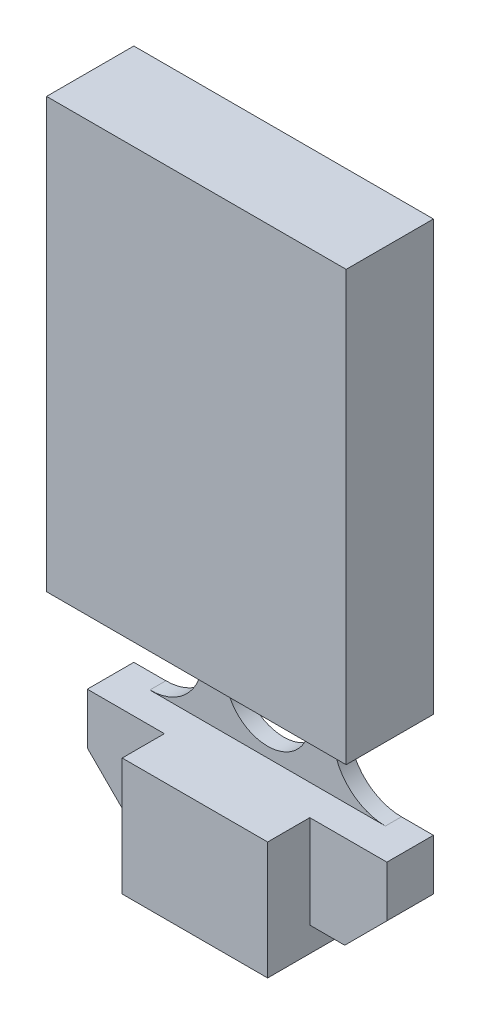
ISO-10303-21;
HEADER;
FILE_DESCRIPTION(('STEP AP214'),'2;1');
FILE_NAME('part.step','',(''),(''),'','','');
FILE_SCHEMA(('AUTOMOTIVE_DESIGN { 1 0 10303 214 1 1 1 1 }'));
ENDSEC;
DATA;
#1=APPLICATION_CONTEXT('core data for automotive mechanical design processes');
#2=APPLICATION_PROTOCOL_DEFINITION('international standard','automotive_design',2000,#1);
#3=PRODUCT_CONTEXT('',#1,'mechanical');
#4=PRODUCT('Part','Part','',(#3));
#5=PRODUCT_RELATED_PRODUCT_CATEGORY('part','',(#4));
#6=PRODUCT_DEFINITION_FORMATION('','',#4);
#7=PRODUCT_DEFINITION_CONTEXT('part definition',#1,'design');
#8=PRODUCT_DEFINITION('design','',#6,#7);
#9=PRODUCT_DEFINITION_SHAPE('','',#8);
#10=(LENGTH_UNIT() NAMED_UNIT(*) SI_UNIT(.MILLI.,.METRE.));
#11=(NAMED_UNIT(*) PLANE_ANGLE_UNIT() SI_UNIT($,.RADIAN.));
#12=(NAMED_UNIT(*) SI_UNIT($,.STERADIAN.) SOLID_ANGLE_UNIT());
#13=UNCERTAINTY_MEASURE_WITH_UNIT(LENGTH_MEASURE(1.E-05),#10,'distance_accuracy_value','');
#14=(GEOMETRIC_REPRESENTATION_CONTEXT(3) GLOBAL_UNCERTAINTY_ASSIGNED_CONTEXT((#13)) GLOBAL_UNIT_ASSIGNED_CONTEXT((#10,
#11,#12)) REPRESENTATION_CONTEXT('',''));
#15=CARTESIAN_POINT('',(0.,0.,0.));
#16=DIRECTION('',(0.,0.,1.));
#17=DIRECTION('',(1.,0.,0.));
#18=AXIS2_PLACEMENT_3D('',#15,#16,#17);
#19=CARTESIAN_POINT('',(0.,0.,1.1));
#20=DIRECTION('',(0.,0.,-1.));
#21=DIRECTION('',(-1.,0.,0.));
#22=AXIS2_PLACEMENT_3D('',#19,#20,#21);
#23=PLANE('',#22);
#24=CARTESIAN_POINT('',(10.3,10.,1.1));
#25=DIRECTION('',(0.,0.,1.));
#26=DIRECTION('',(1.,0.,0.));
#27=AXIS2_PLACEMENT_3D('',#24,#25,#26);
#28=CIRCLE('',#27,2.9);
#29=CARTESIAN_POINT('',(13.2,10.,1.1));
#30=VERTEX_POINT('',#29);
#31=EDGE_CURVE('E219',#30,#30,#28,.T.);
#32=ORIENTED_EDGE('',*,*,#31,.F.);
#33=EDGE_LOOP('',(#32));
#34=FACE_BOUND('',#33,.T.);
#35=DIRECTION('',(-1.,0.,0.));
#36=VECTOR('',#35,1.);
#37=CARTESIAN_POINT('',(5.3,6.4,1.1));
#38=LINE('',#37,#36);
#39=CARTESIAN_POINT('',(18.4,6.4,1.1));
#40=VERTEX_POINT('',#39);
#41=CARTESIAN_POINT('',(2.2,6.4,1.1));
#42=VERTEX_POINT('',#41);
#43=EDGE_CURVE('E278',#40,#42,#38,.T.);
#44=ORIENTED_EDGE('',*,*,#43,.F.);
#45=CARTESIAN_POINT('',(18.4,10.,1.1));
#46=DIRECTION('',(0.,0.,1.));
#47=DIRECTION('',(1.,0.,0.));
#48=AXIS2_PLACEMENT_3D('',#45,#46,#47);
#49=CIRCLE('',#48,3.6);
#50=CARTESIAN_POINT('',(18.4,13.6,1.1));
#51=VERTEX_POINT('',#50);
#52=EDGE_CURVE('E303',#51,#40,#49,.T.);
#53=ORIENTED_EDGE('',*,*,#52,.F.);
#54=DIRECTION('',(1.,0.,0.));
#55=VECTOR('',#54,1.);
#56=CARTESIAN_POINT('',(0.,13.6,1.1));
#57=LINE('',#56,#55);
#58=CARTESIAN_POINT('',(2.2,13.6,1.1));
#59=VERTEX_POINT('',#58);
#60=EDGE_CURVE('E218',#59,#51,#57,.T.);
#61=ORIENTED_EDGE('',*,*,#60,.F.);
#62=CARTESIAN_POINT('',(2.2,10.,1.1));
#63=DIRECTION('',(0.,0.,1.));
#64=DIRECTION('',(-1.,0.,0.));
#65=AXIS2_PLACEMENT_3D('',#62,#63,#64);
#66=CIRCLE('',#65,3.6);
#67=EDGE_CURVE('E315',#42,#59,#66,.T.);
#68=ORIENTED_EDGE('',*,*,#67,.F.);
#69=EDGE_LOOP('',(#44,#53,#61,#68));
#70=FACE_BOUND('',#69,.T.);
#71=ADVANCED_FACE('F33',(#34,#70),#23,.F.);
#72=CARTESIAN_POINT('',(5.3,-1.7,6.1));
#73=DIRECTION('',(1.,0.,0.));
#74=DIRECTION('',(0.,0.,-1.));
#75=AXIS2_PLACEMENT_3D('',#72,#73,#74);
#76=PLANE('',#75);
#77=DIRECTION('',(0.,0.,1.));
#78=VECTOR('',#77,1.);
#79=CARTESIAN_POINT('',(5.3,0.,6.1));
#80=LINE('',#79,#78);
#81=CARTESIAN_POINT('',(5.3,0.,1.1));
#82=VERTEX_POINT('',#81);
#83=CARTESIAN_POINT('',(5.3,0.,3.2));
#84=VERTEX_POINT('',#83);
#85=EDGE_CURVE('E270',#82,#84,#80,.T.);
#86=ORIENTED_EDGE('',*,*,#85,.F.);
#87=DIRECTION('',(0.,-1.,0.));
#88=VECTOR('',#87,1.);
#89=CARTESIAN_POINT('',(5.3,-1.7,1.1));
#90=LINE('',#89,#88);
#91=CARTESIAN_POINT('',(5.3,-1.7,1.1));
#92=VERTEX_POINT('',#91);
#93=EDGE_CURVE('E273',#82,#92,#90,.T.);
#94=ORIENTED_EDGE('',*,*,#93,.T.);
#95=DIRECTION('',(0.,0.,-1.));
#96=VECTOR('',#95,1.);
#97=CARTESIAN_POINT('',(5.3,-1.7,6.1));
#98=LINE('',#97,#96);
#99=CARTESIAN_POINT('',(5.3,-1.7,6.1));
#100=VERTEX_POINT('',#99);
#101=EDGE_CURVE('E300',#100,#92,#98,.T.);
#102=ORIENTED_EDGE('',*,*,#101,.F.);
#103=DIRECTION('',(0.,-1.,0.));
#104=VECTOR('',#103,1.);
#105=CARTESIAN_POINT('',(5.3,-1.7,6.1));
#106=LINE('',#105,#104);
#107=CARTESIAN_POINT('',(5.3,6.4,6.1));
#108=VERTEX_POINT('',#107);
#109=EDGE_CURVE('E274',#108,#100,#106,.T.);
#110=ORIENTED_EDGE('',*,*,#109,.F.);
#111=DIRECTION('',(0.,0.,-1.));
#112=VECTOR('',#111,1.);
#113=CARTESIAN_POINT('',(5.3,6.4,6.1));
#114=LINE('',#113,#112);
#115=CARTESIAN_POINT('',(5.3,6.4,3.2));
#116=VERTEX_POINT('',#115);
#117=EDGE_CURVE('E284',#108,#116,#114,.T.);
#118=ORIENTED_EDGE('',*,*,#117,.T.);
#119=DIRECTION('',(0.,-1.,0.));
#120=VECTOR('',#119,1.);
#121=CARTESIAN_POINT('',(5.3,-1.7,3.2));
#122=LINE('',#121,#120);
#123=EDGE_CURVE('E267',#116,#84,#122,.T.);
#124=ORIENTED_EDGE('',*,*,#123,.T.);
#125=EDGE_LOOP('',(#86,#94,#102,#110,#118,#124));
#126=FACE_BOUND('',#125,.T.);
#127=ADVANCED_FACE('F379',(#126),#76,.F.);
#128=CARTESIAN_POINT('',(15.3,-1.7,6.1));
#129=DIRECTION('',(-1.,0.,0.));
#130=DIRECTION('',(0.,0.,1.));
#131=AXIS2_PLACEMENT_3D('',#128,#129,#130);
#132=PLANE('',#131);
#133=DIRECTION('',(0.,0.,-1.));
#134=VECTOR('',#133,1.);
#135=CARTESIAN_POINT('',(15.3,0.,6.1));
#136=LINE('',#135,#134);
#137=CARTESIAN_POINT('',(15.3,0.,3.2));
#138=VERTEX_POINT('',#137);
#139=CARTESIAN_POINT('',(15.3,0.,1.1));
#140=VERTEX_POINT('',#139);
#141=EDGE_CURVE('E11',#138,#140,#136,.T.);
#142=ORIENTED_EDGE('',*,*,#141,.F.);
#143=DIRECTION('',(0.,1.,0.));
#144=VECTOR('',#143,1.);
#145=CARTESIAN_POINT('',(15.3,-1.7,3.2));
#146=LINE('',#145,#144);
#147=CARTESIAN_POINT('',(15.3,6.4,3.2));
#148=VERTEX_POINT('',#147);
#149=EDGE_CURVE('E264',#138,#148,#146,.T.);
#150=ORIENTED_EDGE('',*,*,#149,.T.);
#151=DIRECTION('',(0.,0.,-1.));
#152=VECTOR('',#151,1.);
#153=CARTESIAN_POINT('',(15.3,6.4,6.1));
#154=LINE('',#153,#152);
#155=CARTESIAN_POINT('',(15.3,6.4,6.1));
#156=VERTEX_POINT('',#155);
#157=EDGE_CURVE('E294',#156,#148,#154,.T.);
#158=ORIENTED_EDGE('',*,*,#157,.F.);
#159=DIRECTION('',(0.,1.,0.));
#160=VECTOR('',#159,1.);
#161=CARTESIAN_POINT('',(15.3,-1.7,6.1));
#162=LINE('',#161,#160);
#163=CARTESIAN_POINT('',(15.3,-1.7,6.1));
#164=VERTEX_POINT('',#163);
#165=EDGE_CURVE('E280',#164,#156,#162,.T.);
#166=ORIENTED_EDGE('',*,*,#165,.F.);
#167=DIRECTION('',(0.,0.,-1.));
#168=VECTOR('',#167,1.);
#169=CARTESIAN_POINT('',(15.3,-1.7,6.1));
#170=LINE('',#169,#168);
#171=CARTESIAN_POINT('',(15.3,-1.7,1.1));
#172=VERTEX_POINT('',#171);
#173=EDGE_CURVE('E297',#164,#172,#170,.T.);
#174=ORIENTED_EDGE('',*,*,#173,.T.);
#175=DIRECTION('',(0.,1.,0.));
#176=VECTOR('',#175,1.);
#177=CARTESIAN_POINT('',(15.3,-1.7,1.1));
#178=LINE('',#177,#176);
#179=EDGE_CURVE('E288',#172,#140,#178,.T.);
#180=ORIENTED_EDGE('',*,*,#179,.T.);
#181=EDGE_LOOP('',(#142,#150,#158,#166,#174,#180));
#182=FACE_BOUND('',#181,.T.);
#183=ADVANCED_FACE('F385',(#182),#132,.F.);
#184=CARTESIAN_POINT('',(20.6,0.,1.1));
#185=DIRECTION('',(-1.,0.,0.));
#186=DIRECTION('',(0.,-1.,0.));
#187=AXIS2_PLACEMENT_3D('',#184,#185,#186);
#188=PLANE('',#187);
#189=DIRECTION('',(0.,1.,0.));
#190=VECTOR('',#189,1.);
#191=CARTESIAN_POINT('',(20.6,6.4,3.2));
#192=LINE('',#191,#190);
#193=CARTESIAN_POINT('',(20.6,2.9,3.2));
#194=VERTEX_POINT('',#193);
#195=CARTESIAN_POINT('',(20.6,6.4,3.2));
#196=VERTEX_POINT('',#195);
#197=EDGE_CURVE('E183',#194,#196,#192,.T.);
#198=ORIENTED_EDGE('',*,*,#197,.F.);
#199=DIRECTION('',(0.,0.,1.));
#200=VECTOR('',#199,1.);
#201=CARTESIAN_POINT('',(20.6,2.9,0.));
#202=LINE('',#201,#200);
#203=CARTESIAN_POINT('',(20.6,2.9,0.));
#204=VERTEX_POINT('',#203);
#205=EDGE_CURVE('E48',#204,#194,#202,.T.);
#206=ORIENTED_EDGE('',*,*,#205,.F.);
#207=DIRECTION('',(0.,1.,0.));
#208=VECTOR('',#207,1.);
#209=CARTESIAN_POINT('',(20.6,0.,0.));
#210=LINE('',#209,#208);
#211=CARTESIAN_POINT('',(20.6,6.4,0.));
#212=VERTEX_POINT('',#211);
#213=EDGE_CURVE('E181',#204,#212,#210,.T.);
#214=ORIENTED_EDGE('',*,*,#213,.T.);
#215=DIRECTION('',(0.,0.,1.));
#216=VECTOR('',#215,1.);
#217=CARTESIAN_POINT('',(20.6,6.4,-3.8));
#218=LINE('',#217,#216);
#219=EDGE_CURVE('E307',#212,#196,#218,.T.);
#220=ORIENTED_EDGE('',*,*,#219,.T.);
#221=EDGE_LOOP('',(#198,#206,#214,#220));
#222=FACE_BOUND('',#221,.T.);
#223=ADVANCED_FACE('F179',(#222),#188,.F.);
#224=CARTESIAN_POINT('',(0.,0.,1.1));
#225=DIRECTION('',(1.,0.,0.));
#226=DIRECTION('',(0.,0.,-1.));
#227=AXIS2_PLACEMENT_3D('',#224,#225,#226);
#228=PLANE('',#227);
#229=DIRECTION('',(0.,-1.,0.));
#230=VECTOR('',#229,1.);
#231=CARTESIAN_POINT('',(0.,0.,0.));
#232=LINE('',#231,#230);
#233=CARTESIAN_POINT('',(0.,43.1,0.));
#234=VERTEX_POINT('',#233);
#235=CARTESIAN_POINT('',(0.,13.6,0.));
#236=VERTEX_POINT('',#235);
#237=EDGE_CURVE('E230',#234,#236,#232,.T.);
#238=ORIENTED_EDGE('',*,*,#237,.T.);
#239=DIRECTION('',(0.,0.,-1.));
#240=VECTOR('',#239,1.);
#241=CARTESIAN_POINT('',(0.,13.6,6.));
#242=LINE('',#241,#240);
#243=CARTESIAN_POINT('',(0.,13.6,6.));
#244=VERTEX_POINT('',#243);
#245=EDGE_CURVE('E207',#244,#236,#242,.T.);
#246=ORIENTED_EDGE('',*,*,#245,.F.);
#247=DIRECTION('',(0.,-1.,0.));
#248=VECTOR('',#247,1.);
#249=CARTESIAN_POINT('',(0.,43.1,6.));
#250=LINE('',#249,#248);
#251=CARTESIAN_POINT('',(0.,43.1,6.));
#252=VERTEX_POINT('',#251);
#253=EDGE_CURVE('E223',#252,#244,#250,.T.);
#254=ORIENTED_EDGE('',*,*,#253,.F.);
#255=DIRECTION('',(0.,0.,-1.));
#256=VECTOR('',#255,1.);
#257=CARTESIAN_POINT('',(0.,43.1,1.1));
#258=LINE('',#257,#256);
#259=EDGE_CURVE('E198',#252,#234,#258,.T.);
#260=ORIENTED_EDGE('',*,*,#259,.T.);
#261=EDGE_LOOP('',(#238,#246,#254,#260));
#262=FACE_BOUND('',#261,.T.);
#263=ADVANCED_FACE('F340',(#262),#228,.F.);
#264=CARTESIAN_POINT('',(0.,6.4,0.));
#265=VERTEX_POINT('',#264);
#266=CARTESIAN_POINT('',(0.,2.9,0.));
#267=VERTEX_POINT('',#266);
#268=EDGE_CURVE('E212',#265,#267,#232,.T.);
#269=ORIENTED_EDGE('',*,*,#268,.T.);
#270=DIRECTION('',(0.,0.,1.));
#271=VECTOR('',#270,1.);
#272=CARTESIAN_POINT('',(0.,2.9,0.));
#273=LINE('',#272,#271);
#274=CARTESIAN_POINT('',(0.,2.9,3.2));
#275=VERTEX_POINT('',#274);
#276=EDGE_CURVE('E241',#267,#275,#273,.T.);
#277=ORIENTED_EDGE('',*,*,#276,.T.);
#278=DIRECTION('',(0.,-1.,0.));
#279=VECTOR('',#278,1.);
#280=CARTESIAN_POINT('',(0.,6.4,3.2));
#281=LINE('',#280,#279);
#282=CARTESIAN_POINT('',(0.,6.4,3.2));
#283=VERTEX_POINT('',#282);
#284=EDGE_CURVE('E254',#283,#275,#281,.T.);
#285=ORIENTED_EDGE('',*,*,#284,.F.);
#286=DIRECTION('',(0.,0.,1.));
#287=VECTOR('',#286,1.);
#288=CARTESIAN_POINT('',(0.,6.4,-3.8));
#289=LINE('',#288,#287);
#290=EDGE_CURVE('E243',#265,#283,#289,.T.);
#291=ORIENTED_EDGE('',*,*,#290,.F.);
#292=EDGE_LOOP('',(#269,#277,#285,#291));
#293=FACE_BOUND('',#292,.T.);
#294=ADVANCED_FACE('F35',(#293),#228,.F.);
#295=CARTESIAN_POINT('',(0.,0.,1.1));
#296=DIRECTION('',(0.,1.,0.));
#297=DIRECTION('',(0.,0.,1.));
#298=AXIS2_PLACEMENT_3D('',#295,#296,#297);
#299=PLANE('',#298);
#300=DIRECTION('',(1.,0.,0.));
#301=VECTOR('',#300,1.);
#302=CARTESIAN_POINT('',(0.,0.,0.));
#303=LINE('',#302,#301);
#304=CARTESIAN_POINT('',(2.89999999999997,0.,0.));
#305=VERTEX_POINT('',#304);
#306=CARTESIAN_POINT('',(17.7,0.,0.));
#307=VERTEX_POINT('',#306);
#308=EDGE_CURVE('E194',#305,#307,#303,.T.);
#309=ORIENTED_EDGE('',*,*,#308,.T.);
#310=DIRECTION('',(0.,0.,1.));
#311=VECTOR('',#310,1.);
#312=CARTESIAN_POINT('',(17.7,0.,0.));
#313=LINE('',#312,#311);
#314=CARTESIAN_POINT('',(17.7,0.,3.2));
#315=VERTEX_POINT('',#314);
#316=EDGE_CURVE('E170',#307,#315,#313,.T.);
#317=ORIENTED_EDGE('',*,*,#316,.T.);
#318=DIRECTION('',(1.,0.,0.));
#319=VECTOR('',#318,1.);
#320=CARTESIAN_POINT('',(0.,0.,3.2));
#321=LINE('',#320,#319);
#322=EDGE_CURVE('E257',#138,#315,#321,.T.);
#323=ORIENTED_EDGE('',*,*,#322,.F.);
#324=ORIENTED_EDGE('',*,*,#141,.T.);
#325=DIRECTION('',(1.,0.,0.));
#326=VECTOR('',#325,1.);
#327=CARTESIAN_POINT('',(0.,0.,1.1));
#328=LINE('',#327,#326);
#329=EDGE_CURVE('E192',#82,#140,#328,.T.);
#330=ORIENTED_EDGE('',*,*,#329,.F.);
#331=ORIENTED_EDGE('',*,*,#85,.T.);
#332=CARTESIAN_POINT('',(2.89999999999997,0.,3.2));
#333=VERTEX_POINT('',#332);
#334=EDGE_CURVE('E258',#333,#84,#321,.T.);
#335=ORIENTED_EDGE('',*,*,#334,.F.);
#336=DIRECTION('',(0.,0.,1.));
#337=VECTOR('',#336,1.);
#338=CARTESIAN_POINT('',(2.89999999999997,0.,0.));
#339=LINE('',#338,#337);
#340=EDGE_CURVE('E56',#305,#333,#339,.T.);
#341=ORIENTED_EDGE('',*,*,#340,.F.);
#342=EDGE_LOOP('',(#309,#317,#323,#324,#330,#331,#335,#341));
#343=FACE_BOUND('',#342,.T.);
#344=ADVANCED_FACE('F399',(#343),#299,.F.);
#345=DIRECTION('',(0.,0.,-1.));
#346=VECTOR('',#345,1.);
#347=CARTESIAN_POINT('',(20.6,13.6,6.));
#348=LINE('',#347,#346);
#349=CARTESIAN_POINT('',(20.6,13.6,6.));
#350=VERTEX_POINT('',#349);
#351=CARTESIAN_POINT('',(20.6,13.6,0.));
#352=VERTEX_POINT('',#351);
#353=EDGE_CURVE('E205',#350,#352,#348,.T.);
#354=ORIENTED_EDGE('',*,*,#353,.T.);
#355=CARTESIAN_POINT('',(20.6,43.1,0.));
#356=VERTEX_POINT('',#355);
#357=EDGE_CURVE('E190',#352,#356,#210,.T.);
#358=ORIENTED_EDGE('',*,*,#357,.T.);
#359=DIRECTION('',(0.,0.,-1.));
#360=VECTOR('',#359,1.);
#361=CARTESIAN_POINT('',(20.6,43.1,1.1));
#362=LINE('',#361,#360);
#363=CARTESIAN_POINT('',(20.6,43.1,6.));
#364=VERTEX_POINT('',#363);
#365=EDGE_CURVE('E201',#364,#356,#362,.T.);
#366=ORIENTED_EDGE('',*,*,#365,.F.);
#367=DIRECTION('',(0.,1.,0.));
#368=VECTOR('',#367,1.);
#369=CARTESIAN_POINT('',(20.6,43.1,6.));
#370=LINE('',#369,#368);
#371=EDGE_CURVE('E331',#350,#364,#370,.T.);
#372=ORIENTED_EDGE('',*,*,#371,.F.);
#373=EDGE_LOOP('',(#354,#358,#366,#372));
#374=FACE_BOUND('',#373,.T.);
#375=ADVANCED_FACE('F397',(#374),#188,.F.);
#376=CARTESIAN_POINT('',(0.,43.1,1.1));
#377=DIRECTION('',(0.,-1.,0.));
#378=DIRECTION('',(0.,0.,-1.));
#379=AXIS2_PLACEMENT_3D('',#376,#377,#378);
#380=PLANE('',#379);
#381=DIRECTION('',(-1.,0.,0.));
#382=VECTOR('',#381,1.);
#383=CARTESIAN_POINT('',(0.,43.1,0.));
#384=LINE('',#383,#382);
#385=EDGE_CURVE('E189',#356,#234,#384,.T.);
#386=ORIENTED_EDGE('',*,*,#385,.T.);
#387=ORIENTED_EDGE('',*,*,#259,.F.);
#388=DIRECTION('',(-1.,0.,0.));
#389=VECTOR('',#388,1.);
#390=CARTESIAN_POINT('',(0.,43.1,6.));
#391=LINE('',#390,#389);
#392=EDGE_CURVE('E208',#364,#252,#391,.T.);
#393=ORIENTED_EDGE('',*,*,#392,.F.);
#394=ORIENTED_EDGE('',*,*,#365,.T.);
#395=EDGE_LOOP('',(#386,#387,#393,#394));
#396=FACE_BOUND('',#395,.T.);
#397=ADVANCED_FACE('F394',(#396),#380,.F.);
#398=CARTESIAN_POINT('',(0.,0.,0.));
#399=DIRECTION('',(0.,0.,-1.));
#400=DIRECTION('',(-1.,0.,0.));
#401=AXIS2_PLACEMENT_3D('',#398,#399,#400);
#402=PLANE('',#401);
#403=DIRECTION('',(-0.707106781186551,-0.707106781186544,0.));
#404=VECTOR('',#403,1.);
#405=CARTESIAN_POINT('',(20.6,2.9,0.));
#406=LINE('',#405,#404);
#407=EDGE_CURVE('E167',#204,#307,#406,.T.);
#408=ORIENTED_EDGE('',*,*,#407,.T.);
#409=ORIENTED_EDGE('',*,*,#308,.F.);
#410=DIRECTION('',(-0.707106781186544,0.707106781186551,0.));
#411=VECTOR('',#410,1.);
#412=CARTESIAN_POINT('',(0.,2.9,0.));
#413=LINE('',#412,#411);
#414=EDGE_CURVE('E247',#305,#267,#413,.T.);
#415=ORIENTED_EDGE('',*,*,#414,.T.);
#416=ORIENTED_EDGE('',*,*,#268,.F.);
#417=DIRECTION('',(-1.,0.,0.));
#418=VECTOR('',#417,1.);
#419=CARTESIAN_POINT('',(0.,6.4,0.));
#420=LINE('',#419,#418);
#421=CARTESIAN_POINT('',(2.2,6.4,0.));
#422=VERTEX_POINT('',#421);
#423=EDGE_CURVE('E204',#422,#265,#420,.T.);
#424=ORIENTED_EDGE('',*,*,#423,.F.);
#425=CARTESIAN_POINT('',(2.2,10.,0.));
#426=DIRECTION('',(0.,0.,-1.));
#427=DIRECTION('',(-1.,0.,0.));
#428=AXIS2_PLACEMENT_3D('',#425,#426,#427);
#429=CIRCLE('',#428,3.6);
#430=CARTESIAN_POINT('',(2.2,13.6,0.));
#431=VERTEX_POINT('',#430);
#432=EDGE_CURVE('E320',#431,#422,#429,.T.);
#433=ORIENTED_EDGE('',*,*,#432,.F.);
#434=DIRECTION('',(1.,0.,0.));
#435=VECTOR('',#434,1.);
#436=CARTESIAN_POINT('',(0.,13.6,0.));
#437=LINE('',#436,#435);
#438=EDGE_CURVE('E344',#236,#431,#437,.T.);
#439=ORIENTED_EDGE('',*,*,#438,.F.);
#440=ORIENTED_EDGE('',*,*,#237,.F.);
#441=ORIENTED_EDGE('',*,*,#385,.F.);
#442=ORIENTED_EDGE('',*,*,#357,.F.);
#443=DIRECTION('',(1.,0.,0.));
#444=VECTOR('',#443,1.);
#445=CARTESIAN_POINT('',(0.,13.6,0.));
#446=LINE('',#445,#444);
#447=CARTESIAN_POINT('',(18.4,13.6,0.));
#448=VERTEX_POINT('',#447);
#449=EDGE_CURVE('E348',#448,#352,#446,.T.);
#450=ORIENTED_EDGE('',*,*,#449,.F.);
#451=CARTESIAN_POINT('',(18.4,10.,0.));
#452=DIRECTION('',(0.,0.,-1.));
#453=DIRECTION('',(-1.,0.,0.));
#454=AXIS2_PLACEMENT_3D('',#451,#452,#453);
#455=CIRCLE('',#454,3.6);
#456=CARTESIAN_POINT('',(18.4,6.4,0.));
#457=VERTEX_POINT('',#456);
#458=EDGE_CURVE('E309',#457,#448,#455,.T.);
#459=ORIENTED_EDGE('',*,*,#458,.F.);
#460=DIRECTION('',(-1.,0.,0.));
#461=VECTOR('',#460,1.);
#462=CARTESIAN_POINT('',(0.,6.4,0.));
#463=LINE('',#462,#461);
#464=EDGE_CURVE('E41',#212,#457,#463,.T.);
#465=ORIENTED_EDGE('',*,*,#464,.F.);
#466=ORIENTED_EDGE('',*,*,#213,.F.);
#467=EDGE_LOOP('',(#408,#409,#415,#416,#424,#433,#439,#440,#441,#442,#450,#459,#465,#466));
#468=FACE_BOUND('',#467,.T.);
#469=CARTESIAN_POINT('',(10.3,10.,0.));
#470=DIRECTION('',(0.,0.,-1.));
#471=DIRECTION('',(-1.,0.,0.));
#472=AXIS2_PLACEMENT_3D('',#469,#470,#471);
#473=CIRCLE('',#472,2.9);
#474=CARTESIAN_POINT('',(7.4,10.,0.));
#475=VERTEX_POINT('',#474);
#476=EDGE_CURVE('E215',#475,#475,#473,.T.);
#477=ORIENTED_EDGE('',*,*,#476,.F.);
#478=EDGE_LOOP('',(#477));
#479=FACE_BOUND('',#478,.T.);
#480=ADVANCED_FACE('F186',(#468,#479),#402,.T.);
#481=CARTESIAN_POINT('',(0.,13.6,6.));
#482=DIRECTION('',(0.,1.,0.));
#483=DIRECTION('',(0.,0.,1.));
#484=AXIS2_PLACEMENT_3D('',#481,#482,#483);
#485=PLANE('',#484);
#486=ORIENTED_EDGE('',*,*,#245,.T.);
#487=ORIENTED_EDGE('',*,*,#438,.T.);
#488=DIRECTION('',(0.,0.,1.));
#489=VECTOR('',#488,1.);
#490=CARTESIAN_POINT('',(2.2,13.6,-3.8));
#491=LINE('',#490,#489);
#492=EDGE_CURVE('E317',#431,#59,#491,.T.);
#493=ORIENTED_EDGE('',*,*,#492,.T.);
#494=ORIENTED_EDGE('',*,*,#60,.T.);
#495=DIRECTION('',(0.,0.,1.));
#496=VECTOR('',#495,1.);
#497=CARTESIAN_POINT('',(18.4,13.6,-3.8));
#498=LINE('',#497,#496);
#499=EDGE_CURVE('E306',#448,#51,#498,.T.);
#500=ORIENTED_EDGE('',*,*,#499,.F.);
#501=ORIENTED_EDGE('',*,*,#449,.T.);
#502=ORIENTED_EDGE('',*,*,#353,.F.);
#503=DIRECTION('',(1.,0.,0.));
#504=VECTOR('',#503,1.);
#505=CARTESIAN_POINT('',(0.,13.6,6.));
#506=LINE('',#505,#504);
#507=EDGE_CURVE('E330',#244,#350,#506,.T.);
#508=ORIENTED_EDGE('',*,*,#507,.F.);
#509=EDGE_LOOP('',(#486,#487,#493,#494,#500,#501,#502,#508));
#510=FACE_BOUND('',#509,.T.);
#511=ADVANCED_FACE('F343',(#510),#485,.F.);
#512=CARTESIAN_POINT('',(0.,0.,6.));
#513=DIRECTION('',(0.,0.,1.));
#514=DIRECTION('',(1.,0.,0.));
#515=AXIS2_PLACEMENT_3D('',#512,#513,#514);
#516=PLANE('',#515);
#517=ORIENTED_EDGE('',*,*,#253,.T.);
#518=ORIENTED_EDGE('',*,*,#507,.T.);
#519=ORIENTED_EDGE('',*,*,#371,.T.);
#520=ORIENTED_EDGE('',*,*,#392,.T.);
#521=EDGE_LOOP('',(#517,#518,#519,#520));
#522=FACE_BOUND('',#521,.T.);
#523=ADVANCED_FACE('F338',(#522),#516,.T.);
#524=CARTESIAN_POINT('',(10.3,10.,-3.8));
#525=DIRECTION('',(0.,0.,1.));
#526=DIRECTION('',(1.,0.,0.));
#527=AXIS2_PLACEMENT_3D('',#524,#525,#526);
#528=CYLINDRICAL_SURFACE('',#527,2.9);
#529=ORIENTED_EDGE('',*,*,#476,.T.);
#530=EDGE_LOOP('',(#529));
#531=FACE_BOUND('',#530,.T.);
#532=ORIENTED_EDGE('',*,*,#31,.T.);
#533=EDGE_LOOP('',(#532));
#534=FACE_BOUND('',#533,.T.);
#535=ADVANCED_FACE('F368',(#531,#534),#528,.F.);
#536=CARTESIAN_POINT('',(2.2,10.,-3.8));
#537=DIRECTION('',(0.,0.,1.));
#538=DIRECTION('',(1.,0.,0.));
#539=AXIS2_PLACEMENT_3D('',#536,#537,#538);
#540=CYLINDRICAL_SURFACE('',#539,3.6);
#541=ORIENTED_EDGE('',*,*,#432,.T.);
#542=DIRECTION('',(0.,0.,1.));
#543=VECTOR('',#542,1.);
#544=CARTESIAN_POINT('',(2.2,6.4,-3.8));
#545=LINE('',#544,#543);
#546=EDGE_CURVE('E321',#422,#42,#545,.T.);
#547=ORIENTED_EDGE('',*,*,#546,.T.);
#548=ORIENTED_EDGE('',*,*,#67,.T.);
#549=ORIENTED_EDGE('',*,*,#492,.F.);
#550=EDGE_LOOP('',(#541,#547,#548,#549));
#551=FACE_BOUND('',#550,.T.);
#552=ADVANCED_FACE('F366',(#551),#540,.F.);
#553=CARTESIAN_POINT('',(2.2,6.4,-3.8));
#554=DIRECTION('',(0.,-1.,0.));
#555=DIRECTION('',(1.,0.,0.));
#556=AXIS2_PLACEMENT_3D('',#553,#554,#555);
#557=PLANE('',#556);
#558=ORIENTED_EDGE('',*,*,#423,.T.);
#559=ORIENTED_EDGE('',*,*,#290,.T.);
#560=DIRECTION('',(-1.,0.,0.));
#561=VECTOR('',#560,1.);
#562=CARTESIAN_POINT('',(0.,6.4,3.2));
#563=LINE('',#562,#561);
#564=EDGE_CURVE('E261',#116,#283,#563,.T.);
#565=ORIENTED_EDGE('',*,*,#564,.F.);
#566=ORIENTED_EDGE('',*,*,#117,.F.);
#567=DIRECTION('',(-1.,0.,0.));
#568=VECTOR('',#567,1.);
#569=CARTESIAN_POINT('',(5.3,6.4,6.1));
#570=LINE('',#569,#568);
#571=EDGE_CURVE('E282',#156,#108,#570,.T.);
#572=ORIENTED_EDGE('',*,*,#571,.F.);
#573=ORIENTED_EDGE('',*,*,#157,.T.);
#574=EDGE_CURVE('E262',#196,#148,#563,.T.);
#575=ORIENTED_EDGE('',*,*,#574,.F.);
#576=ORIENTED_EDGE('',*,*,#219,.F.);
#577=ORIENTED_EDGE('',*,*,#464,.T.);
#578=DIRECTION('',(0.,0.,1.));
#579=VECTOR('',#578,1.);
#580=CARTESIAN_POINT('',(18.4,6.4,-3.8));
#581=LINE('',#580,#579);
#582=EDGE_CURVE('E310',#457,#40,#581,.T.);
#583=ORIENTED_EDGE('',*,*,#582,.T.);
#584=ORIENTED_EDGE('',*,*,#43,.T.);
#585=ORIENTED_EDGE('',*,*,#546,.F.);
#586=EDGE_LOOP('',(#558,#559,#565,#566,#572,#573,#575,#576,#577,#583,#584,#585));
#587=FACE_BOUND('',#586,.T.);
#588=ADVANCED_FACE('F353',(#587),#557,.F.);
#589=CARTESIAN_POINT('',(18.4,10.,-3.8));
#590=DIRECTION('',(0.,0.,1.));
#591=DIRECTION('',(1.,0.,0.));
#592=AXIS2_PLACEMENT_3D('',#589,#590,#591);
#593=CYLINDRICAL_SURFACE('',#592,3.6);
#594=ORIENTED_EDGE('',*,*,#458,.T.);
#595=ORIENTED_EDGE('',*,*,#499,.T.);
#596=ORIENTED_EDGE('',*,*,#52,.T.);
#597=ORIENTED_EDGE('',*,*,#582,.F.);
#598=EDGE_LOOP('',(#594,#595,#596,#597));
#599=FACE_BOUND('',#598,.T.);
#600=ADVANCED_FACE('F356',(#599),#593,.F.);
#601=CARTESIAN_POINT('',(0.,0.,1.1));
#602=DIRECTION('',(0.,0.,-1.));
#603=DIRECTION('',(-1.,0.,0.));
#604=AXIS2_PLACEMENT_3D('',#601,#602,#603);
#605=PLANE('',#604);
#606=ORIENTED_EDGE('',*,*,#329,.T.);
#607=ORIENTED_EDGE('',*,*,#179,.F.);
#608=DIRECTION('',(1.,0.,0.));
#609=VECTOR('',#608,1.);
#610=CARTESIAN_POINT('',(5.3,-1.7,1.1));
#611=LINE('',#610,#609);
#612=EDGE_CURVE('E286',#92,#172,#611,.T.);
#613=ORIENTED_EDGE('',*,*,#612,.F.);
#614=ORIENTED_EDGE('',*,*,#93,.F.);
#615=EDGE_LOOP('',(#606,#607,#613,#614));
#616=FACE_BOUND('',#615,.T.);
#617=ADVANCED_FACE('F430',(#616),#605,.T.);
#618=CARTESIAN_POINT('',(5.3,-1.7,6.1));
#619=DIRECTION('',(0.,1.,0.));
#620=DIRECTION('',(0.,0.,1.));
#621=AXIS2_PLACEMENT_3D('',#618,#619,#620);
#622=PLANE('',#621);
#623=ORIENTED_EDGE('',*,*,#612,.T.);
#624=ORIENTED_EDGE('',*,*,#173,.F.);
#625=DIRECTION('',(1.,0.,0.));
#626=VECTOR('',#625,1.);
#627=CARTESIAN_POINT('',(5.3,-1.7,6.1));
#628=LINE('',#627,#626);
#629=EDGE_CURVE('E277',#100,#164,#628,.T.);
#630=ORIENTED_EDGE('',*,*,#629,.F.);
#631=ORIENTED_EDGE('',*,*,#101,.T.);
#632=EDGE_LOOP('',(#623,#624,#630,#631));
#633=FACE_BOUND('',#632,.T.);
#634=ADVANCED_FACE('F428',(#633),#622,.F.);
#635=CARTESIAN_POINT('',(0.,0.,6.1));
#636=DIRECTION('',(0.,0.,-1.));
#637=DIRECTION('',(-1.,0.,0.));
#638=AXIS2_PLACEMENT_3D('',#635,#636,#637);
#639=PLANE('',#638);
#640=ORIENTED_EDGE('',*,*,#109,.T.);
#641=ORIENTED_EDGE('',*,*,#629,.T.);
#642=ORIENTED_EDGE('',*,*,#165,.T.);
#643=ORIENTED_EDGE('',*,*,#571,.T.);
#644=EDGE_LOOP('',(#640,#641,#642,#643));
#645=FACE_BOUND('',#644,.T.);
#646=ADVANCED_FACE('F425',(#645),#639,.F.);
#647=CARTESIAN_POINT('',(0.,0.,3.2));
#648=DIRECTION('',(0.,0.,1.));
#649=DIRECTION('',(1.,0.,0.));
#650=AXIS2_PLACEMENT_3D('',#647,#648,#649);
#651=PLANE('',#650);
#652=DIRECTION('',(-0.707106781186551,-0.707106781186544,0.));
#653=VECTOR('',#652,1.);
#654=CARTESIAN_POINT('',(20.6,2.9,3.2));
#655=LINE('',#654,#653);
#656=EDGE_CURVE('E175',#194,#315,#655,.T.);
#657=ORIENTED_EDGE('',*,*,#656,.F.);
#658=ORIENTED_EDGE('',*,*,#197,.T.);
#659=ORIENTED_EDGE('',*,*,#574,.T.);
#660=ORIENTED_EDGE('',*,*,#149,.F.);
#661=ORIENTED_EDGE('',*,*,#322,.T.);
#662=EDGE_LOOP('',(#657,#658,#659,#660,#661));
#663=FACE_BOUND('',#662,.T.);
#664=ADVANCED_FACE('F422',(#663),#651,.T.);
#665=DIRECTION('',(-0.707106781186544,0.707106781186551,0.));
#666=VECTOR('',#665,1.);
#667=CARTESIAN_POINT('',(0.,2.9,3.2));
#668=LINE('',#667,#666);
#669=EDGE_CURVE('E248',#333,#275,#668,.T.);
#670=ORIENTED_EDGE('',*,*,#669,.F.);
#671=ORIENTED_EDGE('',*,*,#334,.T.);
#672=ORIENTED_EDGE('',*,*,#123,.F.);
#673=ORIENTED_EDGE('',*,*,#564,.T.);
#674=ORIENTED_EDGE('',*,*,#284,.T.);
#675=EDGE_LOOP('',(#670,#671,#672,#673,#674));
#676=FACE_BOUND('',#675,.T.);
#677=ADVANCED_FACE('F411',(#676),#651,.T.);
#678=CARTESIAN_POINT('',(0.,2.9,0.));
#679=DIRECTION('',(0.707106781186551,0.707106781186544,0.));
#680=DIRECTION('',(-0.707106781186544,0.707106781186551,0.));
#681=AXIS2_PLACEMENT_3D('',#678,#679,#680);
#682=PLANE('',#681);
#683=ORIENTED_EDGE('',*,*,#669,.T.);
#684=ORIENTED_EDGE('',*,*,#276,.F.);
#685=ORIENTED_EDGE('',*,*,#414,.F.);
#686=ORIENTED_EDGE('',*,*,#340,.T.);
#687=EDGE_LOOP('',(#683,#684,#685,#686));
#688=FACE_BOUND('',#687,.T.);
#689=ADVANCED_FACE('F414',(#688),#682,.F.);
#690=CARTESIAN_POINT('',(20.6,2.9,0.));
#691=DIRECTION('',(-0.707106781186544,0.707106781186551,0.));
#692=DIRECTION('',(-0.707106781186551,-0.707106781186544,0.));
#693=AXIS2_PLACEMENT_3D('',#690,#691,#692);
#694=PLANE('',#693);
#695=ORIENTED_EDGE('',*,*,#656,.T.);
#696=ORIENTED_EDGE('',*,*,#316,.F.);
#697=ORIENTED_EDGE('',*,*,#407,.F.);
#698=ORIENTED_EDGE('',*,*,#205,.T.);
#699=EDGE_LOOP('',(#695,#696,#697,#698));
#700=FACE_BOUND('',#699,.T.);
#701=ADVANCED_FACE('F168',(#700),#694,.F.);
#702=CLOSED_SHELL('',(#71,#127,#183,#223,#263,#294,#344,#375,#397,#480,#511,#523,#535,#552,#588,
#600,#617,#634,#646,#664,#677,#689,#701));
#703=MANIFOLD_SOLID_BREP('B2',#702);
#704=ADVANCED_BREP_SHAPE_REPRESENTATION('',(#18,#703),#14);
#705=SHAPE_DEFINITION_REPRESENTATION(#9,#704);
ENDSEC;
END-ISO-10303-21;
